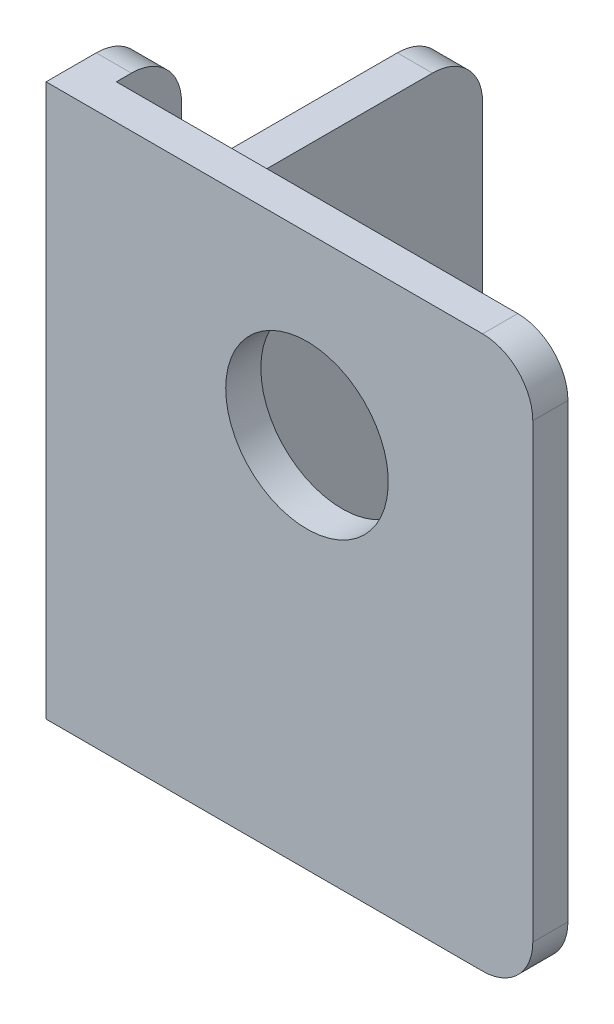
ISO-10303-21;
HEADER;
FILE_DESCRIPTION(('STEP AP214'),'2;1');
FILE_NAME('part.step','',(''),(''),'','','');
FILE_SCHEMA(('AUTOMOTIVE_DESIGN { 1 0 10303 214 1 1 1 1 }'));
ENDSEC;
DATA;
#1=APPLICATION_CONTEXT('core data for automotive mechanical design processes');
#2=APPLICATION_PROTOCOL_DEFINITION('international standard','automotive_design',2000,#1);
#3=PRODUCT_CONTEXT('',#1,'mechanical');
#4=PRODUCT('Part','Part','',(#3));
#5=PRODUCT_RELATED_PRODUCT_CATEGORY('part','',(#4));
#6=PRODUCT_DEFINITION_FORMATION('','',#4);
#7=PRODUCT_DEFINITION_CONTEXT('part definition',#1,'design');
#8=PRODUCT_DEFINITION('design','',#6,#7);
#9=PRODUCT_DEFINITION_SHAPE('','',#8);
#10=(LENGTH_UNIT() NAMED_UNIT(*) SI_UNIT(.MILLI.,.METRE.));
#11=(NAMED_UNIT(*) PLANE_ANGLE_UNIT() SI_UNIT($,.RADIAN.));
#12=(NAMED_UNIT(*) SI_UNIT($,.STERADIAN.) SOLID_ANGLE_UNIT());
#13=UNCERTAINTY_MEASURE_WITH_UNIT(LENGTH_MEASURE(1.E-05),#10,'distance_accuracy_value','');
#14=(GEOMETRIC_REPRESENTATION_CONTEXT(3) GLOBAL_UNCERTAINTY_ASSIGNED_CONTEXT((#13)) GLOBAL_UNIT_ASSIGNED_CONTEXT((#10,
#11,#12)) REPRESENTATION_CONTEXT('',''));
#15=CARTESIAN_POINT('',(0.,0.,0.));
#16=DIRECTION('',(0.,0.,1.));
#17=DIRECTION('',(1.,0.,0.));
#18=AXIS2_PLACEMENT_3D('',#15,#16,#17);
#19=CARTESIAN_POINT('',(48.5,27.5,0.));
#20=DIRECTION('',(0.,0.,-1.));
#21=DIRECTION('',(-1.,0.,0.));
#22=AXIS2_PLACEMENT_3D('',#19,#20,#21);
#23=PLANE('',#22);
#24=CARTESIAN_POINT('',(26.,10.,0.));
#25=DIRECTION('',(0.,0.,-1.));
#26=DIRECTION('',(-1.,0.,0.));
#27=AXIS2_PLACEMENT_3D('',#24,#25,#26);
#28=CIRCLE('',#27,8.1);
#29=CARTESIAN_POINT('',(17.9,10.,0.));
#30=VERTEX_POINT('',#29);
#31=EDGE_CURVE('E169',#30,#30,#28,.T.);
#32=ORIENTED_EDGE('',*,*,#31,.T.);
#33=EDGE_LOOP('',(#32));
#34=FACE_BOUND('',#33,.T.);
#35=DIRECTION('',(1.,0.,0.));
#36=VECTOR('',#35,1.);
#37=CARTESIAN_POINT('',(48.5,-27.5,0.));
#38=LINE('',#37,#36);
#39=CARTESIAN_POINT('',(0.,-27.5,0.));
#40=VERTEX_POINT('',#39);
#41=CARTESIAN_POINT('',(43.5,-27.5,0.));
#42=VERTEX_POINT('',#41);
#43=EDGE_CURVE('E166',#40,#42,#38,.T.);
#44=ORIENTED_EDGE('',*,*,#43,.T.);
#45=CARTESIAN_POINT('',(43.5,-22.5,0.));
#46=DIRECTION('',(0.,0.,-1.));
#47=DIRECTION('',(-1.,0.,0.));
#48=AXIS2_PLACEMENT_3D('',#45,#46,#47);
#49=CIRCLE('',#48,5.);
#50=CARTESIAN_POINT('',(48.5,-22.5,0.));
#51=VERTEX_POINT('',#50);
#52=EDGE_CURVE('E216',#42,#51,#49,.F.);
#53=ORIENTED_EDGE('',*,*,#52,.T.);
#54=DIRECTION('',(0.,-1.,0.));
#55=VECTOR('',#54,1.);
#56=CARTESIAN_POINT('',(48.5,27.5,0.));
#57=LINE('',#56,#55);
#58=CARTESIAN_POINT('',(48.5,22.5,0.));
#59=VERTEX_POINT('',#58);
#60=EDGE_CURVE('E183',#59,#51,#57,.T.);
#61=ORIENTED_EDGE('',*,*,#60,.F.);
#62=CARTESIAN_POINT('',(43.5,22.5,0.));
#63=DIRECTION('',(0.,0.,-1.));
#64=DIRECTION('',(-1.,0.,0.));
#65=AXIS2_PLACEMENT_3D('',#62,#63,#64);
#66=CIRCLE('',#65,5.);
#67=CARTESIAN_POINT('',(43.5,27.5,0.));
#68=VERTEX_POINT('',#67);
#69=EDGE_CURVE('E47',#59,#68,#66,.F.);
#70=ORIENTED_EDGE('',*,*,#69,.T.);
#71=DIRECTION('',(1.,0.,0.));
#72=VECTOR('',#71,1.);
#73=CARTESIAN_POINT('',(48.5,27.5,0.));
#74=LINE('',#73,#72);
#75=CARTESIAN_POINT('',(0.,27.5,0.));
#76=VERTEX_POINT('',#75);
#77=EDGE_CURVE('E143',#76,#68,#74,.T.);
#78=ORIENTED_EDGE('',*,*,#77,.F.);
#79=DIRECTION('',(0.,-1.,0.));
#80=VECTOR('',#79,1.);
#81=CARTESIAN_POINT('',(0.,27.5,0.));
#82=LINE('',#81,#80);
#83=EDGE_CURVE('E162',#76,#40,#82,.T.);
#84=ORIENTED_EDGE('',*,*,#83,.T.);
#85=EDGE_LOOP('',(#44,#53,#61,#70,#78,#84));
#86=FACE_BOUND('',#85,.T.);
#87=ADVANCED_FACE('F32',(#34,#86),#23,.F.);
#88=CARTESIAN_POINT('',(48.5,27.5,-3.5));
#89=DIRECTION('',(-1.,0.,0.));
#90=DIRECTION('',(0.,0.,1.));
#91=AXIS2_PLACEMENT_3D('',#88,#89,#90);
#92=PLANE('',#91);
#93=ORIENTED_EDGE('',*,*,#60,.T.);
#94=DIRECTION('',(0.,0.,-1.));
#95=VECTOR('',#94,1.);
#96=CARTESIAN_POINT('',(48.5,-22.5,-3.5));
#97=LINE('',#96,#95);
#98=CARTESIAN_POINT('',(48.5,-22.5,-3.5));
#99=VERTEX_POINT('',#98);
#100=EDGE_CURVE('E209',#51,#99,#97,.T.);
#101=ORIENTED_EDGE('',*,*,#100,.T.);
#102=DIRECTION('',(0.,-1.,0.));
#103=VECTOR('',#102,1.);
#104=CARTESIAN_POINT('',(48.5,27.5,-3.5));
#105=LINE('',#104,#103);
#106=CARTESIAN_POINT('',(48.5,22.5,-3.5));
#107=VERTEX_POINT('',#106);
#108=EDGE_CURVE('E154',#107,#99,#105,.T.);
#109=ORIENTED_EDGE('',*,*,#108,.F.);
#110=DIRECTION('',(0.,0.,-1.));
#111=VECTOR('',#110,1.);
#112=CARTESIAN_POINT('',(48.5,22.5,-3.5));
#113=LINE('',#112,#111);
#114=EDGE_CURVE('E207',#107,#59,#113,.F.);
#115=ORIENTED_EDGE('',*,*,#114,.T.);
#116=EDGE_LOOP('',(#93,#101,#109,#115));
#117=FACE_BOUND('',#116,.T.);
#118=ADVANCED_FACE('F280',(#117),#92,.F.);
#119=CARTESIAN_POINT('',(3.5,27.5,-3.5));
#120=DIRECTION('',(0.,0.,1.));
#121=DIRECTION('',(1.,0.,0.));
#122=AXIS2_PLACEMENT_3D('',#119,#120,#121);
#123=PLANE('',#122);
#124=CARTESIAN_POINT('',(26.,10.,-3.5));
#125=DIRECTION('',(0.,0.,-1.));
#126=DIRECTION('',(-1.,0.,0.));
#127=AXIS2_PLACEMENT_3D('',#124,#125,#126);
#128=CIRCLE('',#127,8.1);
#129=CARTESIAN_POINT('',(17.9,10.,-3.5));
#130=VERTEX_POINT('',#129);
#131=EDGE_CURVE('E271',#130,#130,#128,.T.);
#132=ORIENTED_EDGE('',*,*,#131,.F.);
#133=EDGE_LOOP('',(#132));
#134=FACE_BOUND('',#133,.T.);
#135=ORIENTED_EDGE('',*,*,#108,.T.);
#136=CARTESIAN_POINT('',(43.5,-22.5,-3.5));
#137=DIRECTION('',(0.,0.,1.));
#138=DIRECTION('',(1.,0.,0.));
#139=AXIS2_PLACEMENT_3D('',#136,#137,#138);
#140=CIRCLE('',#139,5.);
#141=CARTESIAN_POINT('',(43.5,-27.5,-3.5));
#142=VERTEX_POINT('',#141);
#143=EDGE_CURVE('E213',#99,#142,#140,.F.);
#144=ORIENTED_EDGE('',*,*,#143,.T.);
#145=DIRECTION('',(-1.,0.,0.));
#146=VECTOR('',#145,1.);
#147=CARTESIAN_POINT('',(3.5,-27.5,-3.5));
#148=LINE('',#147,#146);
#149=CARTESIAN_POINT('',(3.5,-27.5,-3.5));
#150=VERTEX_POINT('',#149);
#151=EDGE_CURVE('E150',#142,#150,#148,.T.);
#152=ORIENTED_EDGE('',*,*,#151,.T.);
#153=DIRECTION('',(0.,-1.,0.));
#154=VECTOR('',#153,1.);
#155=CARTESIAN_POINT('',(3.5,27.5,-3.5));
#156=LINE('',#155,#154);
#157=CARTESIAN_POINT('',(3.5,27.5,-3.5));
#158=VERTEX_POINT('',#157);
#159=EDGE_CURVE('E146',#158,#150,#156,.T.);
#160=ORIENTED_EDGE('',*,*,#159,.F.);
#161=DIRECTION('',(-1.,0.,0.));
#162=VECTOR('',#161,1.);
#163=CARTESIAN_POINT('',(3.5,27.5,-3.5));
#164=LINE('',#163,#162);
#165=CARTESIAN_POINT('',(43.5,27.5,-3.5));
#166=VERTEX_POINT('',#165);
#167=EDGE_CURVE('E135',#166,#158,#164,.T.);
#168=ORIENTED_EDGE('',*,*,#167,.F.);
#169=CARTESIAN_POINT('',(43.5,22.5,-3.5));
#170=DIRECTION('',(0.,0.,1.));
#171=DIRECTION('',(1.,0.,0.));
#172=AXIS2_PLACEMENT_3D('',#169,#170,#171);
#173=CIRCLE('',#172,5.);
#174=EDGE_CURVE('E55',#166,#107,#173,.F.);
#175=ORIENTED_EDGE('',*,*,#174,.T.);
#176=EDGE_LOOP('',(#135,#144,#152,#160,#168,#175));
#177=FACE_BOUND('',#176,.T.);
#178=ADVANCED_FACE('F148',(#134,#177),#123,.F.);
#179=CARTESIAN_POINT('',(3.5,27.5,-40.));
#180=DIRECTION('',(-1.,0.,0.));
#181=DIRECTION('',(0.,0.,1.));
#182=AXIS2_PLACEMENT_3D('',#179,#180,#181);
#183=PLANE('',#182);
#184=CARTESIAN_POINT('',(3.5,-17.5,-33.));
#185=DIRECTION('',(-1.,0.,0.));
#186=DIRECTION('',(0.,0.,1.));
#187=AXIS2_PLACEMENT_3D('',#184,#185,#186);
#188=CIRCLE('',#187,2.74999999999999);
#189=CARTESIAN_POINT('',(3.5,-17.5,-30.25));
#190=VERTEX_POINT('',#189);
#191=EDGE_CURVE('E258',#190,#190,#188,.T.);
#192=ORIENTED_EDGE('',*,*,#191,.T.);
#193=EDGE_LOOP('',(#192));
#194=FACE_BOUND('',#193,.T.);
#195=CARTESIAN_POINT('',(3.5,-17.5,-10.5));
#196=DIRECTION('',(-1.,0.,0.));
#197=DIRECTION('',(0.,0.,1.));
#198=AXIS2_PLACEMENT_3D('',#195,#196,#197);
#199=CIRCLE('',#198,2.74999999999999);
#200=CARTESIAN_POINT('',(3.5,-17.5,-7.75000000000001));
#201=VERTEX_POINT('',#200);
#202=EDGE_CURVE('E268',#201,#201,#199,.T.);
#203=ORIENTED_EDGE('',*,*,#202,.T.);
#204=EDGE_LOOP('',(#203));
#205=FACE_BOUND('',#204,.T.);
#206=DIRECTION('',(0.,0.,-1.));
#207=VECTOR('',#206,1.);
#208=CARTESIAN_POINT('',(3.5,-27.5,-40.));
#209=LINE('',#208,#207);
#210=CARTESIAN_POINT('',(3.5,-27.5,-35.));
#211=VERTEX_POINT('',#210);
#212=EDGE_CURVE('E171',#150,#211,#209,.T.);
#213=ORIENTED_EDGE('',*,*,#212,.T.);
#214=CARTESIAN_POINT('',(3.5,-22.5,-35.));
#215=DIRECTION('',(-1.,0.,0.));
#216=DIRECTION('',(0.,0.,1.));
#217=AXIS2_PLACEMENT_3D('',#214,#215,#216);
#218=CIRCLE('',#217,5.);
#219=CARTESIAN_POINT('',(3.5,-22.5,-40.));
#220=VERTEX_POINT('',#219);
#221=EDGE_CURVE('E205',#211,#220,#218,.F.);
#222=ORIENTED_EDGE('',*,*,#221,.T.);
#223=DIRECTION('',(0.,-1.,0.));
#224=VECTOR('',#223,1.);
#225=CARTESIAN_POINT('',(3.5,27.5,-40.));
#226=LINE('',#225,#224);
#227=CARTESIAN_POINT('',(3.5,7.5,-40.));
#228=VERTEX_POINT('',#227);
#229=EDGE_CURVE('E155',#228,#220,#226,.T.);
#230=ORIENTED_EDGE('',*,*,#229,.F.);
#231=CARTESIAN_POINT('',(3.5,7.5,-35.));
#232=DIRECTION('',(-1.,0.,0.));
#233=DIRECTION('',(0.,0.,1.));
#234=AXIS2_PLACEMENT_3D('',#231,#232,#233);
#235=CIRCLE('',#234,5.);
#236=CARTESIAN_POINT('',(3.5,12.5,-35.));
#237=VERTEX_POINT('',#236);
#238=EDGE_CURVE('E203',#228,#237,#235,.F.);
#239=ORIENTED_EDGE('',*,*,#238,.T.);
#240=DIRECTION('',(0.,0.,-1.));
#241=VECTOR('',#240,1.);
#242=CARTESIAN_POINT('',(3.5,12.5,-40.));
#243=LINE('',#242,#241);
#244=CARTESIAN_POINT('',(3.5,12.5,-15.));
#245=VERTEX_POINT('',#244);
#246=EDGE_CURVE('E234',#245,#237,#243,.T.);
#247=ORIENTED_EDGE('',*,*,#246,.F.);
#248=CARTESIAN_POINT('',(3.5,17.5,-15.));
#249=DIRECTION('',(-1.,0.,0.));
#250=DIRECTION('',(0.,0.,1.));
#251=AXIS2_PLACEMENT_3D('',#248,#249,#250);
#252=CIRCLE('',#251,5.);
#253=CARTESIAN_POINT('',(3.5,17.5,-10.));
#254=VERTEX_POINT('',#253);
#255=EDGE_CURVE('E40',#245,#254,#252,.T.);
#256=ORIENTED_EDGE('',*,*,#255,.T.);
#257=DIRECTION('',(0.,-1.,0.));
#258=VECTOR('',#257,1.);
#259=CARTESIAN_POINT('',(3.5,27.5,-10.));
#260=LINE('',#259,#258);
#261=CARTESIAN_POINT('',(3.5,22.5,-10.));
#262=VERTEX_POINT('',#261);
#263=EDGE_CURVE('E232',#262,#254,#260,.T.);
#264=ORIENTED_EDGE('',*,*,#263,.F.);
#265=CARTESIAN_POINT('',(3.5,22.5,-5.));
#266=DIRECTION('',(-1.,0.,0.));
#267=DIRECTION('',(0.,0.,1.));
#268=AXIS2_PLACEMENT_3D('',#265,#266,#267);
#269=CIRCLE('',#268,5.);
#270=CARTESIAN_POINT('',(3.5,27.5,-5.));
#271=VERTEX_POINT('',#270);
#272=EDGE_CURVE('E159',#262,#271,#269,.F.);
#273=ORIENTED_EDGE('',*,*,#272,.T.);
#274=DIRECTION('',(0.,0.,-1.));
#275=VECTOR('',#274,1.);
#276=CARTESIAN_POINT('',(3.5,27.5,-40.));
#277=LINE('',#276,#275);
#278=EDGE_CURVE('E139',#158,#271,#277,.T.);
#279=ORIENTED_EDGE('',*,*,#278,.F.);
#280=ORIENTED_EDGE('',*,*,#159,.T.);
#281=EDGE_LOOP('',(#213,#222,#230,#239,#247,#256,#264,#273,#279,#280));
#282=FACE_BOUND('',#281,.T.);
#283=ADVANCED_FACE('F157',(#194,#205,#282),#183,.F.);
#284=CARTESIAN_POINT('',(0.,27.5,-40.));
#285=DIRECTION('',(0.,0.,1.));
#286=DIRECTION('',(1.,0.,0.));
#287=AXIS2_PLACEMENT_3D('',#284,#285,#286);
#288=PLANE('',#287);
#289=ORIENTED_EDGE('',*,*,#229,.T.);
#290=DIRECTION('',(-1.,0.,0.));
#291=VECTOR('',#290,1.);
#292=CARTESIAN_POINT('',(0.,-22.5,-40.));
#293=LINE('',#292,#291);
#294=CARTESIAN_POINT('',(0.,-22.5,-40.));
#295=VERTEX_POINT('',#294);
#296=EDGE_CURVE('E189',#220,#295,#293,.T.);
#297=ORIENTED_EDGE('',*,*,#296,.T.);
#298=DIRECTION('',(0.,-1.,0.));
#299=VECTOR('',#298,1.);
#300=CARTESIAN_POINT('',(0.,27.5,-40.));
#301=LINE('',#300,#299);
#302=CARTESIAN_POINT('',(0.,7.5,-40.));
#303=VERTEX_POINT('',#302);
#304=EDGE_CURVE('E177',#303,#295,#301,.T.);
#305=ORIENTED_EDGE('',*,*,#304,.F.);
#306=DIRECTION('',(1.,0.,0.));
#307=VECTOR('',#306,1.);
#308=CARTESIAN_POINT('',(0.,7.5,-40.));
#309=LINE('',#308,#307);
#310=EDGE_CURVE('E186',#303,#228,#309,.T.);
#311=ORIENTED_EDGE('',*,*,#310,.T.);
#312=EDGE_LOOP('',(#289,#297,#305,#311));
#313=FACE_BOUND('',#312,.T.);
#314=ADVANCED_FACE('F298',(#313),#288,.F.);
#315=CARTESIAN_POINT('',(0.,27.5,0.));
#316=DIRECTION('',(1.,0.,0.));
#317=DIRECTION('',(0.,0.,-1.));
#318=AXIS2_PLACEMENT_3D('',#315,#316,#317);
#319=PLANE('',#318);
#320=CARTESIAN_POINT('',(0.,-17.5,-33.));
#321=DIRECTION('',(-1.,0.,0.));
#322=DIRECTION('',(0.,0.,1.));
#323=AXIS2_PLACEMENT_3D('',#320,#321,#322);
#324=CIRCLE('',#323,2.74999999999999);
#325=CARTESIAN_POINT('',(0.,-17.5,-30.25));
#326=VERTEX_POINT('',#325);
#327=EDGE_CURVE('E255',#326,#326,#324,.T.);
#328=ORIENTED_EDGE('',*,*,#327,.F.);
#329=EDGE_LOOP('',(#328));
#330=FACE_BOUND('',#329,.T.);
#331=CARTESIAN_POINT('',(0.,-17.5,-10.5));
#332=DIRECTION('',(-1.,0.,0.));
#333=DIRECTION('',(0.,0.,1.));
#334=AXIS2_PLACEMENT_3D('',#331,#332,#333);
#335=CIRCLE('',#334,2.74999999999999);
#336=CARTESIAN_POINT('',(0.,-17.5,-7.75000000000001));
#337=VERTEX_POINT('',#336);
#338=EDGE_CURVE('E265',#337,#337,#335,.T.);
#339=ORIENTED_EDGE('',*,*,#338,.F.);
#340=EDGE_LOOP('',(#339));
#341=FACE_BOUND('',#340,.T.);
#342=ORIENTED_EDGE('',*,*,#304,.T.);
#343=CARTESIAN_POINT('',(0.,-22.5,-35.));
#344=DIRECTION('',(1.,0.,0.));
#345=DIRECTION('',(0.,0.,-1.));
#346=AXIS2_PLACEMENT_3D('',#343,#344,#345);
#347=CIRCLE('',#346,5.);
#348=CARTESIAN_POINT('',(0.,-27.5,-35.));
#349=VERTEX_POINT('',#348);
#350=EDGE_CURVE('E196',#295,#349,#347,.F.);
#351=ORIENTED_EDGE('',*,*,#350,.T.);
#352=DIRECTION('',(0.,0.,1.));
#353=VECTOR('',#352,1.);
#354=CARTESIAN_POINT('',(0.,-27.5,0.));
#355=LINE('',#354,#353);
#356=EDGE_CURVE('E173',#349,#40,#355,.T.);
#357=ORIENTED_EDGE('',*,*,#356,.T.);
#358=ORIENTED_EDGE('',*,*,#83,.F.);
#359=DIRECTION('',(0.,0.,1.));
#360=VECTOR('',#359,1.);
#361=CARTESIAN_POINT('',(0.,27.5,0.));
#362=LINE('',#361,#360);
#363=CARTESIAN_POINT('',(0.,27.5,-5.));
#364=VERTEX_POINT('',#363);
#365=EDGE_CURVE('E160',#364,#76,#362,.T.);
#366=ORIENTED_EDGE('',*,*,#365,.F.);
#367=CARTESIAN_POINT('',(0.,22.5,-5.));
#368=DIRECTION('',(1.,0.,0.));
#369=DIRECTION('',(0.,0.,-1.));
#370=AXIS2_PLACEMENT_3D('',#367,#368,#369);
#371=CIRCLE('',#370,5.);
#372=CARTESIAN_POINT('',(0.,22.5,-10.));
#373=VERTEX_POINT('',#372);
#374=EDGE_CURVE('E192',#364,#373,#371,.F.);
#375=ORIENTED_EDGE('',*,*,#374,.T.);
#376=DIRECTION('',(0.,-1.,0.));
#377=VECTOR('',#376,1.);
#378=CARTESIAN_POINT('',(0.,27.5,-10.));
#379=LINE('',#378,#377);
#380=CARTESIAN_POINT('',(0.,17.5,-10.));
#381=VERTEX_POINT('',#380);
#382=EDGE_CURVE('E251',#373,#381,#379,.T.);
#383=ORIENTED_EDGE('',*,*,#382,.T.);
#384=CARTESIAN_POINT('',(0.,17.5,-15.));
#385=DIRECTION('',(1.,0.,0.));
#386=DIRECTION('',(0.,0.,-1.));
#387=AXIS2_PLACEMENT_3D('',#384,#385,#386);
#388=CIRCLE('',#387,5.);
#389=CARTESIAN_POINT('',(0.,12.5,-15.));
#390=VERTEX_POINT('',#389);
#391=EDGE_CURVE('E11',#381,#390,#388,.T.);
#392=ORIENTED_EDGE('',*,*,#391,.T.);
#393=DIRECTION('',(0.,0.,-1.));
#394=VECTOR('',#393,1.);
#395=CARTESIAN_POINT('',(0.,12.5,-40.));
#396=LINE('',#395,#394);
#397=CARTESIAN_POINT('',(0.,12.5,-35.));
#398=VERTEX_POINT('',#397);
#399=EDGE_CURVE('E249',#390,#398,#396,.T.);
#400=ORIENTED_EDGE('',*,*,#399,.T.);
#401=CARTESIAN_POINT('',(0.,7.5,-35.));
#402=DIRECTION('',(1.,0.,0.));
#403=DIRECTION('',(0.,0.,-1.));
#404=AXIS2_PLACEMENT_3D('',#401,#402,#403);
#405=CIRCLE('',#404,5.);
#406=EDGE_CURVE('E194',#398,#303,#405,.F.);
#407=ORIENTED_EDGE('',*,*,#406,.T.);
#408=EDGE_LOOP('',(#342,#351,#357,#358,#366,#375,#383,#392,#400,#407));
#409=FACE_BOUND('',#408,.T.);
#410=ADVANCED_FACE('F248',(#330,#341,#409),#319,.F.);
#411=CARTESIAN_POINT('',(0.,27.5,0.));
#412=DIRECTION('',(0.,-1.,0.));
#413=DIRECTION('',(0.,0.,-1.));
#414=AXIS2_PLACEMENT_3D('',#411,#412,#413);
#415=PLANE('',#414);
#416=ORIENTED_EDGE('',*,*,#77,.T.);
#417=DIRECTION('',(0.,0.,-1.));
#418=VECTOR('',#417,1.);
#419=CARTESIAN_POINT('',(43.5,27.5,0.));
#420=LINE('',#419,#418);
#421=EDGE_CURVE('E141',#68,#166,#420,.T.);
#422=ORIENTED_EDGE('',*,*,#421,.T.);
#423=ORIENTED_EDGE('',*,*,#167,.T.);
#424=ORIENTED_EDGE('',*,*,#278,.T.);
#425=DIRECTION('',(1.,0.,0.));
#426=VECTOR('',#425,1.);
#427=CARTESIAN_POINT('',(0.,27.5,-5.));
#428=LINE('',#427,#426);
#429=EDGE_CURVE('E218',#271,#364,#428,.F.);
#430=ORIENTED_EDGE('',*,*,#429,.T.);
#431=ORIENTED_EDGE('',*,*,#365,.T.);
#432=EDGE_LOOP('',(#416,#422,#423,#424,#430,#431));
#433=FACE_BOUND('',#432,.T.);
#434=ADVANCED_FACE('F137',(#433),#415,.F.);
#435=CARTESIAN_POINT('',(0.,-27.5,0.));
#436=DIRECTION('',(0.,-1.,0.));
#437=DIRECTION('',(0.,0.,-1.));
#438=AXIS2_PLACEMENT_3D('',#435,#436,#437);
#439=PLANE('',#438);
#440=ORIENTED_EDGE('',*,*,#356,.F.);
#441=DIRECTION('',(-1.,0.,0.));
#442=VECTOR('',#441,1.);
#443=CARTESIAN_POINT('',(3.5,-27.5,-35.));
#444=LINE('',#443,#442);
#445=EDGE_CURVE('E200',#349,#211,#444,.F.);
#446=ORIENTED_EDGE('',*,*,#445,.T.);
#447=ORIENTED_EDGE('',*,*,#212,.F.);
#448=ORIENTED_EDGE('',*,*,#151,.F.);
#449=DIRECTION('',(0.,0.,-1.));
#450=VECTOR('',#449,1.);
#451=CARTESIAN_POINT('',(43.5,-27.5,0.));
#452=LINE('',#451,#450);
#453=EDGE_CURVE('E198',#142,#42,#452,.F.);
#454=ORIENTED_EDGE('',*,*,#453,.T.);
#455=ORIENTED_EDGE('',*,*,#43,.F.);
#456=EDGE_LOOP('',(#440,#446,#447,#448,#454,#455));
#457=FACE_BOUND('',#456,.T.);
#458=ADVANCED_FACE('F289',(#457),#439,.T.);
#459=CARTESIAN_POINT('',(26.,10.,0.));
#460=DIRECTION('',(0.,0.,-1.));
#461=DIRECTION('',(-1.,0.,0.));
#462=AXIS2_PLACEMENT_3D('',#459,#460,#461);
#463=CYLINDRICAL_SURFACE('',#462,8.1);
#464=ORIENTED_EDGE('',*,*,#31,.F.);
#465=EDGE_LOOP('',(#464));
#466=FACE_BOUND('',#465,.T.);
#467=ORIENTED_EDGE('',*,*,#131,.T.);
#468=EDGE_LOOP('',(#467));
#469=FACE_BOUND('',#468,.T.);
#470=ADVANCED_FACE('F389',(#466,#469),#463,.F.);
#471=CARTESIAN_POINT('',(0.,-17.5,-10.5));
#472=DIRECTION('',(-1.,0.,0.));
#473=DIRECTION('',(0.,0.,1.));
#474=AXIS2_PLACEMENT_3D('',#471,#472,#473);
#475=CYLINDRICAL_SURFACE('',#474,2.74999999999999);
#476=ORIENTED_EDGE('',*,*,#338,.T.);
#477=EDGE_LOOP('',(#476));
#478=FACE_BOUND('',#477,.T.);
#479=ORIENTED_EDGE('',*,*,#202,.F.);
#480=EDGE_LOOP('',(#479));
#481=FACE_BOUND('',#480,.T.);
#482=ADVANCED_FACE('F380',(#478,#481),#475,.F.);
#483=CARTESIAN_POINT('',(0.,-17.5,-33.));
#484=DIRECTION('',(-1.,0.,0.));
#485=DIRECTION('',(0.,0.,1.));
#486=AXIS2_PLACEMENT_3D('',#483,#484,#485);
#487=CYLINDRICAL_SURFACE('',#486,2.74999999999999);
#488=ORIENTED_EDGE('',*,*,#327,.T.);
#489=EDGE_LOOP('',(#488));
#490=FACE_BOUND('',#489,.T.);
#491=ORIENTED_EDGE('',*,*,#191,.F.);
#492=EDGE_LOOP('',(#491));
#493=FACE_BOUND('',#492,.T.);
#494=ADVANCED_FACE('F371',(#490,#493),#487,.F.);
#495=CARTESIAN_POINT('',(0.,12.5,-40.));
#496=DIRECTION('',(0.,-1.,0.));
#497=DIRECTION('',(0.,0.,-1.));
#498=AXIS2_PLACEMENT_3D('',#495,#496,#497);
#499=PLANE('',#498);
#500=ORIENTED_EDGE('',*,*,#246,.T.);
#501=DIRECTION('',(1.,0.,0.));
#502=VECTOR('',#501,1.);
#503=CARTESIAN_POINT('',(0.,12.5,-35.));
#504=LINE('',#503,#502);
#505=EDGE_CURVE('E224',#237,#398,#504,.F.);
#506=ORIENTED_EDGE('',*,*,#505,.T.);
#507=ORIENTED_EDGE('',*,*,#399,.F.);
#508=DIRECTION('',(1.,0.,0.));
#509=VECTOR('',#508,1.);
#510=CARTESIAN_POINT('',(3.5,12.5,-15.));
#511=LINE('',#510,#509);
#512=EDGE_CURVE('E221',#390,#245,#511,.T.);
#513=ORIENTED_EDGE('',*,*,#512,.T.);
#514=EDGE_LOOP('',(#500,#506,#507,#513));
#515=FACE_BOUND('',#514,.T.);
#516=ADVANCED_FACE('F253',(#515),#499,.F.);
#517=CARTESIAN_POINT('',(0.,27.5,-10.));
#518=DIRECTION('',(0.,0.,1.));
#519=DIRECTION('',(1.,0.,0.));
#520=AXIS2_PLACEMENT_3D('',#517,#518,#519);
#521=PLANE('',#520);
#522=ORIENTED_EDGE('',*,*,#382,.F.);
#523=DIRECTION('',(1.,0.,0.));
#524=VECTOR('',#523,1.);
#525=CARTESIAN_POINT('',(0.,22.5,-10.));
#526=LINE('',#525,#524);
#527=EDGE_CURVE('E228',#373,#262,#526,.T.);
#528=ORIENTED_EDGE('',*,*,#527,.T.);
#529=ORIENTED_EDGE('',*,*,#263,.T.);
#530=DIRECTION('',(1.,0.,0.));
#531=VECTOR('',#530,1.);
#532=CARTESIAN_POINT('',(0.,17.5,-10.));
#533=LINE('',#532,#531);
#534=EDGE_CURVE('E226',#254,#381,#533,.F.);
#535=ORIENTED_EDGE('',*,*,#534,.T.);
#536=EDGE_LOOP('',(#522,#528,#529,#535));
#537=FACE_BOUND('',#536,.T.);
#538=ADVANCED_FACE('F240',(#537),#521,.F.);
#539=CARTESIAN_POINT('',(0.,-22.5,-35.));
#540=DIRECTION('',(1.,0.,0.));
#541=DIRECTION('',(0.,0.,-1.));
#542=AXIS2_PLACEMENT_3D('',#539,#540,#541);
#543=CYLINDRICAL_SURFACE('',#542,5.);
#544=ORIENTED_EDGE('',*,*,#221,.F.);
#545=ORIENTED_EDGE('',*,*,#445,.F.);
#546=ORIENTED_EDGE('',*,*,#350,.F.);
#547=ORIENTED_EDGE('',*,*,#296,.F.);
#548=EDGE_LOOP('',(#544,#545,#546,#547));
#549=FACE_BOUND('',#548,.T.);
#550=ADVANCED_FACE('F295',(#549),#543,.T.);
#551=CARTESIAN_POINT('',(43.5,-22.5,-3.5));
#552=DIRECTION('',(0.,0.,1.));
#553=DIRECTION('',(1.,0.,0.));
#554=AXIS2_PLACEMENT_3D('',#551,#552,#553);
#555=CYLINDRICAL_SURFACE('',#554,5.);
#556=ORIENTED_EDGE('',*,*,#52,.F.);
#557=ORIENTED_EDGE('',*,*,#453,.F.);
#558=ORIENTED_EDGE('',*,*,#143,.F.);
#559=ORIENTED_EDGE('',*,*,#100,.F.);
#560=EDGE_LOOP('',(#556,#557,#558,#559));
#561=FACE_BOUND('',#560,.T.);
#562=ADVANCED_FACE('F286',(#561),#555,.T.);
#563=CARTESIAN_POINT('',(43.5,22.5,0.));
#564=DIRECTION('',(0.,0.,-1.));
#565=DIRECTION('',(-1.,0.,0.));
#566=AXIS2_PLACEMENT_3D('',#563,#564,#565);
#567=CYLINDRICAL_SURFACE('',#566,5.);
#568=ORIENTED_EDGE('',*,*,#69,.F.);
#569=ORIENTED_EDGE('',*,*,#114,.F.);
#570=ORIENTED_EDGE('',*,*,#174,.F.);
#571=ORIENTED_EDGE('',*,*,#421,.F.);
#572=EDGE_LOOP('',(#568,#569,#570,#571));
#573=FACE_BOUND('',#572,.T.);
#574=ADVANCED_FACE('F277',(#573),#567,.T.);
#575=CARTESIAN_POINT('',(0.,7.5,-35.));
#576=DIRECTION('',(1.,0.,0.));
#577=DIRECTION('',(0.,1.,0.));
#578=AXIS2_PLACEMENT_3D('',#575,#576,#577);
#579=CYLINDRICAL_SURFACE('',#578,5.);
#580=ORIENTED_EDGE('',*,*,#406,.F.);
#581=ORIENTED_EDGE('',*,*,#505,.F.);
#582=ORIENTED_EDGE('',*,*,#238,.F.);
#583=ORIENTED_EDGE('',*,*,#310,.F.);
#584=EDGE_LOOP('',(#580,#581,#582,#583));
#585=FACE_BOUND('',#584,.T.);
#586=ADVANCED_FACE('F301',(#585),#579,.T.);
#587=CARTESIAN_POINT('',(0.,22.5,-5.));
#588=DIRECTION('',(1.,0.,0.));
#589=DIRECTION('',(0.,0.,-1.));
#590=AXIS2_PLACEMENT_3D('',#587,#588,#589);
#591=CYLINDRICAL_SURFACE('',#590,5.);
#592=ORIENTED_EDGE('',*,*,#374,.F.);
#593=ORIENTED_EDGE('',*,*,#429,.F.);
#594=ORIENTED_EDGE('',*,*,#272,.F.);
#595=ORIENTED_EDGE('',*,*,#527,.F.);
#596=EDGE_LOOP('',(#592,#593,#594,#595));
#597=FACE_BOUND('',#596,.T.);
#598=ADVANCED_FACE('F303',(#597),#591,.T.);
#599=CARTESIAN_POINT('',(0.,17.5,-15.));
#600=DIRECTION('',(-1.,0.,0.));
#601=DIRECTION('',(0.,0.,1.));
#602=AXIS2_PLACEMENT_3D('',#599,#600,#601);
#603=CYLINDRICAL_SURFACE('',#602,5.);
#604=ORIENTED_EDGE('',*,*,#391,.F.);
#605=ORIENTED_EDGE('',*,*,#534,.F.);
#606=ORIENTED_EDGE('',*,*,#255,.F.);
#607=ORIENTED_EDGE('',*,*,#512,.F.);
#608=EDGE_LOOP('',(#604,#605,#606,#607));
#609=FACE_BOUND('',#608,.T.);
#610=ADVANCED_FACE('F34',(#609),#603,.F.);
#611=CLOSED_SHELL('',(#87,#118,#178,#283,#314,#410,#434,#458,#470,#482,#494,#516,#538,#550,#562,
#574,#586,#598,#610));
#612=MANIFOLD_SOLID_BREP('B2',#611);
#613=ADVANCED_BREP_SHAPE_REPRESENTATION('',(#18,#612),#14);
#614=SHAPE_DEFINITION_REPRESENTATION(#9,#613);
ENDSEC;
END-ISO-10303-21;
